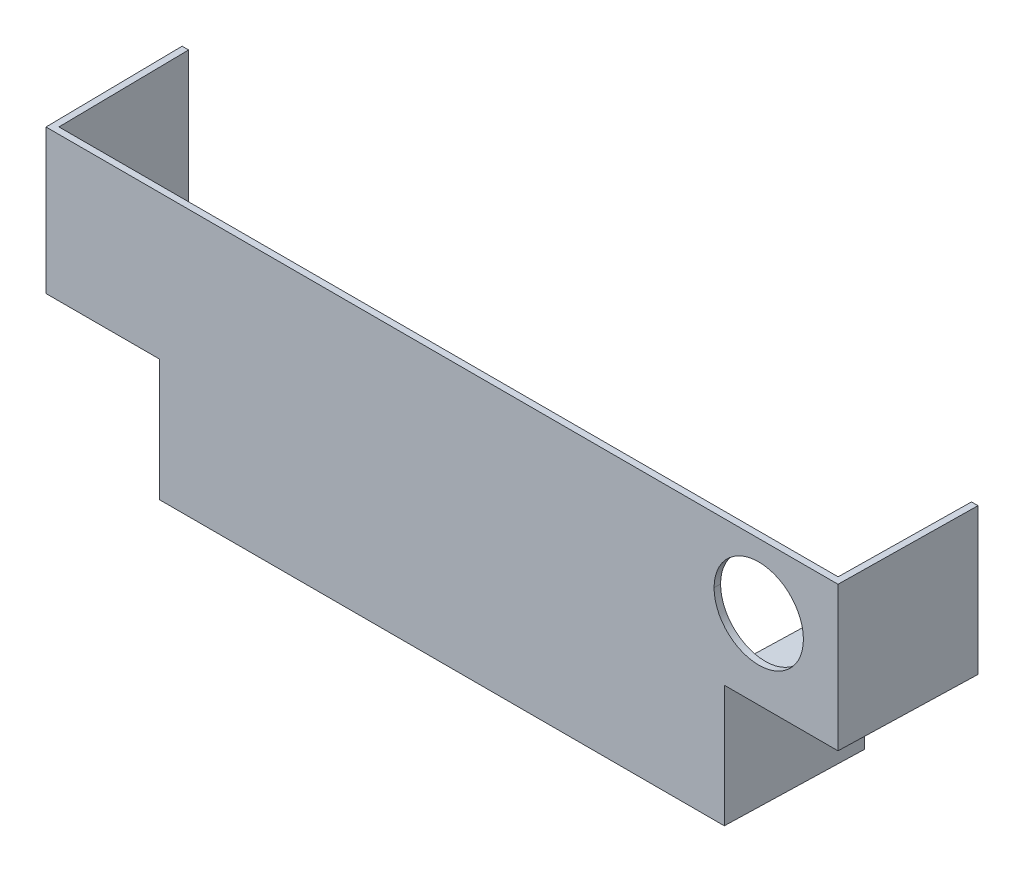
ISO-10303-21;
HEADER;
FILE_DESCRIPTION(('STEP AP214'),'2;1');
FILE_NAME('part.step','',(''),(''),'','','');
FILE_SCHEMA(('AUTOMOTIVE_DESIGN { 1 0 10303 214 1 1 1 1 }'));
ENDSEC;
DATA;
#1=APPLICATION_CONTEXT('core data for automotive mechanical design processes');
#2=APPLICATION_PROTOCOL_DEFINITION('international standard','automotive_design',2000,#1);
#3=PRODUCT_CONTEXT('',#1,'mechanical');
#4=PRODUCT('Part','Part','',(#3));
#5=PRODUCT_RELATED_PRODUCT_CATEGORY('part','',(#4));
#6=PRODUCT_DEFINITION_FORMATION('','',#4);
#7=PRODUCT_DEFINITION_CONTEXT('part definition',#1,'design');
#8=PRODUCT_DEFINITION('design','',#6,#7);
#9=PRODUCT_DEFINITION_SHAPE('','',#8);
#10=(LENGTH_UNIT() NAMED_UNIT(*) SI_UNIT(.MILLI.,.METRE.));
#11=(NAMED_UNIT(*) PLANE_ANGLE_UNIT() SI_UNIT($,.RADIAN.));
#12=(NAMED_UNIT(*) SI_UNIT($,.STERADIAN.) SOLID_ANGLE_UNIT());
#13=UNCERTAINTY_MEASURE_WITH_UNIT(LENGTH_MEASURE(1.E-05),#10,'distance_accuracy_value','');
#14=(GEOMETRIC_REPRESENTATION_CONTEXT(3) GLOBAL_UNCERTAINTY_ASSIGNED_CONTEXT((#13)) GLOBAL_UNIT_ASSIGNED_CONTEXT((#10,
#11,#12)) REPRESENTATION_CONTEXT('',''));
#15=CARTESIAN_POINT('',(0.,0.,0.));
#16=DIRECTION('',(0.,0.,1.));
#17=DIRECTION('',(1.,0.,0.));
#18=AXIS2_PLACEMENT_3D('',#15,#16,#17);
#19=CARTESIAN_POINT('',(90.437462,78.859218,-0.8500024));
#20=DIRECTION('',(0.,0.,1.));
#21=DIRECTION('',(1.,0.,0.));
#22=AXIS2_PLACEMENT_3D('',#19,#20,#21);
#23=CYLINDRICAL_SURFACE('',#22,2.75);
#24=DIRECTION('',(0.,0.,1.));
#25=VECTOR('',#24,1.);
#26=CARTESIAN_POINT('',(87.687462,78.859218,8.1));
#27=LINE('',#26,#25);
#28=CARTESIAN_POINT('',(87.687462,78.859218,8.1));
#29=VERTEX_POINT('',#28);
#30=CARTESIAN_POINT('',(87.687462,78.859218,8.5));
#31=VERTEX_POINT('',#30);
#32=EDGE_CURVE('E11',#29,#31,#27,.T.);
#33=ORIENTED_EDGE('',*,*,#32,.T.);
#34=CARTESIAN_POINT('',(90.437462,78.859218,8.5));
#35=DIRECTION('',(0.,0.,-1.));
#36=DIRECTION('',(1.,0.,0.));
#37=AXIS2_PLACEMENT_3D('',#34,#35,#36);
#38=CIRCLE('',#37,2.75);
#39=CARTESIAN_POINT('',(93.187462,78.859218,8.5));
#40=VERTEX_POINT('',#39);
#41=EDGE_CURVE('E304',#40,#31,#38,.T.);
#42=ORIENTED_EDGE('',*,*,#41,.F.);
#43=DIRECTION('',(0.,0.,1.));
#44=VECTOR('',#43,1.);
#45=CARTESIAN_POINT('',(93.187462,78.859218,8.1));
#46=LINE('',#45,#44);
#47=CARTESIAN_POINT('',(93.187462,78.859218,8.1));
#48=VERTEX_POINT('',#47);
#49=EDGE_CURVE('E28',#48,#40,#46,.T.);
#50=ORIENTED_EDGE('',*,*,#49,.F.);
#51=CARTESIAN_POINT('',(90.437462,78.859218,8.1));
#52=DIRECTION('',(0.,0.,1.));
#53=DIRECTION('',(-1.,0.,0.));
#54=AXIS2_PLACEMENT_3D('',#51,#52,#53);
#55=CIRCLE('',#54,2.75);
#56=EDGE_CURVE('E279',#29,#48,#55,.T.);
#57=ORIENTED_EDGE('',*,*,#56,.F.);
#58=EDGE_LOOP('',(#33,#42,#50,#57));
#59=FACE_BOUND('',#58,.T.);
#60=ADVANCED_FACE('F17',(#59),#23,.F.);
#61=CARTESIAN_POINT('',(90.437462,78.859218,-0.8500024));
#62=DIRECTION('',(0.,0.,1.));
#63=DIRECTION('',(1.,0.,0.));
#64=AXIS2_PLACEMENT_3D('',#61,#62,#63);
#65=CYLINDRICAL_SURFACE('',#64,2.75);
#66=ORIENTED_EDGE('',*,*,#49,.T.);
#67=CARTESIAN_POINT('',(90.437462,78.859218,8.5));
#68=DIRECTION('',(0.,0.,-1.));
#69=DIRECTION('',(-1.,0.,0.));
#70=AXIS2_PLACEMENT_3D('',#67,#68,#69);
#71=CIRCLE('',#70,2.75);
#72=EDGE_CURVE('E332',#31,#40,#71,.T.);
#73=ORIENTED_EDGE('',*,*,#72,.F.);
#74=ORIENTED_EDGE('',*,*,#32,.F.);
#75=CARTESIAN_POINT('',(90.437462,78.859218,8.1));
#76=DIRECTION('',(0.,0.,1.));
#77=DIRECTION('',(1.,0.,0.));
#78=AXIS2_PLACEMENT_3D('',#75,#76,#77);
#79=CIRCLE('',#78,2.75);
#80=EDGE_CURVE('E321',#48,#29,#79,.T.);
#81=ORIENTED_EDGE('',*,*,#80,.F.);
#82=EDGE_LOOP('',(#66,#73,#74,#81));
#83=FACE_BOUND('',#82,.T.);
#84=ADVANCED_FACE('F395',(#83),#65,.F.);
#85=CARTESIAN_POINT('',(0.,0.,8.1));
#86=DIRECTION('',(0.,0.,1.));
#87=DIRECTION('',(1.,0.,0.));
#88=AXIS2_PLACEMENT_3D('',#85,#86,#87);
#89=PLANE('',#88);
#90=ORIENTED_EDGE('',*,*,#56,.T.);
#91=ORIENTED_EDGE('',*,*,#80,.T.);
#92=EDGE_LOOP('',(#90,#91));
#93=FACE_BOUND('',#92,.T.);
#94=DIRECTION('',(-1.,0.,0.));
#95=VECTOR('',#94,1.);
#96=CARTESIAN_POINT('',(94.92435731426,74.37232268574,8.1));
#97=LINE('',#96,#95);
#98=CARTESIAN_POINT('',(94.92435731426,74.37232268574,8.1));
#99=VERTEX_POINT('',#98);
#100=CARTESIAN_POINT('',(87.92435731426,74.37232268574,8.1));
#101=VERTEX_POINT('',#100);
#102=EDGE_CURVE('E251',#99,#101,#97,.T.);
#103=ORIENTED_EDGE('',*,*,#102,.T.);
#104=DIRECTION('',(0.,-1.,0.));
#105=VECTOR('',#104,1.);
#106=CARTESIAN_POINT('',(87.92435731426,74.37232268574,8.1));
#107=LINE('',#106,#105);
#108=CARTESIAN_POINT('',(87.92435731426,66.87232268574,8.1));
#109=VERTEX_POINT('',#108);
#110=EDGE_CURVE('E244',#101,#109,#107,.T.);
#111=ORIENTED_EDGE('',*,*,#110,.T.);
#112=DIRECTION('',(-1.,0.,0.));
#113=VECTOR('',#112,1.);
#114=CARTESIAN_POINT('',(87.92435731426,66.87232268574,8.1));
#115=LINE('',#114,#113);
#116=CARTESIAN_POINT('',(53.95056668574,66.87232268574,8.1));
#117=VERTEX_POINT('',#116);
#118=EDGE_CURVE('E245',#109,#117,#115,.T.);
#119=ORIENTED_EDGE('',*,*,#118,.T.);
#120=DIRECTION('',(0.,1.,0.));
#121=VECTOR('',#120,1.);
#122=CARTESIAN_POINT('',(53.95056668574,66.87232268574,8.1));
#123=LINE('',#122,#121);
#124=CARTESIAN_POINT('',(53.95056668574,74.37232268574,8.1));
#125=VERTEX_POINT('',#124);
#126=EDGE_CURVE('E219',#117,#125,#123,.T.);
#127=ORIENTED_EDGE('',*,*,#126,.T.);
#128=DIRECTION('',(-1.,0.,0.));
#129=VECTOR('',#128,1.);
#130=CARTESIAN_POINT('',(53.95056668574,74.37232268574,8.1));
#131=LINE('',#130,#129);
#132=CARTESIAN_POINT('',(46.95056668574,74.37232268574,8.1));
#133=VERTEX_POINT('',#132);
#134=EDGE_CURVE('E220',#125,#133,#131,.T.);
#135=ORIENTED_EDGE('',*,*,#134,.T.);
#136=DIRECTION('',(0.,1.,0.));
#137=VECTOR('',#136,1.);
#138=CARTESIAN_POINT('',(46.95056668574,74.37232268574,8.1));
#139=LINE('',#138,#137);
#140=CARTESIAN_POINT('',(46.95056668574,82.859218,8.1));
#141=VERTEX_POINT('',#140);
#142=EDGE_CURVE('E227',#133,#141,#139,.T.);
#143=ORIENTED_EDGE('',*,*,#142,.T.);
#144=DIRECTION('',(1.,0.,0.));
#145=VECTOR('',#144,1.);
#146=CARTESIAN_POINT('',(46.95056668574,82.859218,8.1));
#147=LINE('',#146,#145);
#148=CARTESIAN_POINT('',(94.92435731426,82.859218,8.1));
#149=VERTEX_POINT('',#148);
#150=EDGE_CURVE('E317',#141,#149,#147,.T.);
#151=ORIENTED_EDGE('',*,*,#150,.T.);
#152=DIRECTION('',(0.,-1.,0.));
#153=VECTOR('',#152,1.);
#154=CARTESIAN_POINT('',(94.92435731426,82.859218,8.1));
#155=LINE('',#154,#153);
#156=EDGE_CURVE('E250',#149,#99,#155,.T.);
#157=ORIENTED_EDGE('',*,*,#156,.T.);
#158=EDGE_LOOP('',(#103,#111,#119,#127,#135,#143,#151,#157));
#159=FACE_BOUND('',#158,.T.);
#160=ADVANCED_FACE('F399',(#93,#159),#89,.F.);
#161=CARTESIAN_POINT('',(95.037462,82.859218,0.));
#162=DIRECTION('',(0.999902524009304,0.,0.0139621803391542));
#163=DIRECTION('',(0.,-1.,0.));
#164=AXIS2_PLACEMENT_3D('',#161,#162,#163);
#165=PLANE('',#164);
#166=ORIENTED_EDGE('',*,*,#156,.F.);
#167=DIRECTION('',(-0.0139621803392142,0.,0.999902524009303));
#168=VECTOR('',#167,1.);
#169=CARTESIAN_POINT('',(95.037462,82.859218,0.));
#170=LINE('',#169,#168);
#171=CARTESIAN_POINT('',(95.037462,82.859218,0.));
#172=VERTEX_POINT('',#171);
#173=EDGE_CURVE('E293',#172,#149,#170,.T.);
#174=ORIENTED_EDGE('',*,*,#173,.F.);
#175=DIRECTION('',(0.,-1.,0.));
#176=VECTOR('',#175,1.);
#177=CARTESIAN_POINT('',(95.037462,82.859218,0.));
#178=LINE('',#177,#176);
#179=CARTESIAN_POINT('',(95.037462,74.259218,0.));
#180=VERTEX_POINT('',#179);
#181=EDGE_CURVE('E262',#172,#180,#178,.T.);
#182=ORIENTED_EDGE('',*,*,#181,.T.);
#183=DIRECTION('',(-0.0139608196271266,0.0139608196271266,0.999805076517757));
#184=VECTOR('',#183,1.);
#185=CARTESIAN_POINT('',(95.037462,74.259218,0.));
#186=LINE('',#185,#184);
#187=EDGE_CURVE('E246',#180,#99,#186,.T.);
#188=ORIENTED_EDGE('',*,*,#187,.T.);
#189=EDGE_LOOP('',(#166,#174,#182,#188));
#190=FACE_BOUND('',#189,.T.);
#191=ADVANCED_FACE('F412',(#190),#165,.F.);
#192=CARTESIAN_POINT('',(53.837462,74.259218,0.));
#193=DIRECTION('',(0.,-0.999902524009304,0.0139621803391542));
#194=DIRECTION('',(-1.,0.,0.));
#195=AXIS2_PLACEMENT_3D('',#192,#193,#194);
#196=PLANE('',#195);
#197=ORIENTED_EDGE('',*,*,#102,.F.);
#198=ORIENTED_EDGE('',*,*,#187,.F.);
#199=DIRECTION('',(-1.,0.,0.));
#200=VECTOR('',#199,1.);
#201=CARTESIAN_POINT('',(95.037462,74.259218,0.));
#202=LINE('',#201,#200);
#203=CARTESIAN_POINT('',(88.037462,74.259218,0.));
#204=VERTEX_POINT('',#203);
#205=EDGE_CURVE('E258',#180,#204,#202,.T.);
#206=ORIENTED_EDGE('',*,*,#205,.T.);
#207=DIRECTION('',(0.0139608196271266,-0.0139608196271266,-0.999805076517757));
#208=VECTOR('',#207,1.);
#209=CARTESIAN_POINT('',(87.92435731426,74.37232268574,8.1));
#210=LINE('',#209,#208);
#211=EDGE_CURVE('E264',#101,#204,#210,.T.);
#212=ORIENTED_EDGE('',*,*,#211,.F.);
#213=EDGE_LOOP('',(#197,#198,#206,#212));
#214=FACE_BOUND('',#213,.T.);
#215=ADVANCED_FACE('F417',(#214),#196,.F.);
#216=CARTESIAN_POINT('',(88.037462,74.259218,0.));
#217=DIRECTION('',(0.999902524009304,0.,0.0139621803391542));
#218=DIRECTION('',(0.,-1.,0.));
#219=AXIS2_PLACEMENT_3D('',#216,#217,#218);
#220=PLANE('',#219);
#221=ORIENTED_EDGE('',*,*,#110,.F.);
#222=ORIENTED_EDGE('',*,*,#211,.T.);
#223=DIRECTION('',(0.,-1.,0.));
#224=VECTOR('',#223,1.);
#225=CARTESIAN_POINT('',(88.037462,74.259218,0.));
#226=LINE('',#225,#224);
#227=CARTESIAN_POINT('',(88.037462,66.759218,0.));
#228=VERTEX_POINT('',#227);
#229=EDGE_CURVE('E263',#204,#228,#226,.T.);
#230=ORIENTED_EDGE('',*,*,#229,.T.);
#231=DIRECTION('',(-0.0139608196271266,0.0139608196271266,0.999805076517757));
#232=VECTOR('',#231,1.);
#233=CARTESIAN_POINT('',(88.037462,66.759218,0.));
#234=LINE('',#233,#232);
#235=EDGE_CURVE('E240',#228,#109,#234,.T.);
#236=ORIENTED_EDGE('',*,*,#235,.T.);
#237=EDGE_LOOP('',(#221,#222,#230,#236));
#238=FACE_BOUND('',#237,.T.);
#239=ADVANCED_FACE('F424',(#238),#220,.F.);
#240=CARTESIAN_POINT('',(88.037462,66.759218,0.));
#241=DIRECTION('',(0.,-0.999902524009304,0.0139621803391542));
#242=DIRECTION('',(-1.,0.,0.));
#243=AXIS2_PLACEMENT_3D('',#240,#241,#242);
#244=PLANE('',#243);
#245=ORIENTED_EDGE('',*,*,#118,.F.);
#246=ORIENTED_EDGE('',*,*,#235,.F.);
#247=DIRECTION('',(-1.,0.,0.));
#248=VECTOR('',#247,1.);
#249=CARTESIAN_POINT('',(88.037462,66.759218,0.));
#250=LINE('',#249,#248);
#251=CARTESIAN_POINT('',(53.837462,66.759218,0.));
#252=VERTEX_POINT('',#251);
#253=EDGE_CURVE('E273',#228,#252,#250,.T.);
#254=ORIENTED_EDGE('',*,*,#253,.T.);
#255=DIRECTION('',(0.0139608196271266,0.0139608196271266,0.999805076517757));
#256=VECTOR('',#255,1.);
#257=CARTESIAN_POINT('',(53.837462,66.759218,0.));
#258=LINE('',#257,#256);
#259=EDGE_CURVE('E353',#252,#117,#258,.T.);
#260=ORIENTED_EDGE('',*,*,#259,.T.);
#261=EDGE_LOOP('',(#245,#246,#254,#260));
#262=FACE_BOUND('',#261,.T.);
#263=ADVANCED_FACE('F431',(#262),#244,.F.);
#264=CARTESIAN_POINT('',(53.837462,66.759218,0.));
#265=DIRECTION('',(-0.999902524009304,0.,0.0139621803391542));
#266=DIRECTION('',(0.,1.,0.));
#267=AXIS2_PLACEMENT_3D('',#264,#265,#266);
#268=PLANE('',#267);
#269=ORIENTED_EDGE('',*,*,#126,.F.);
#270=ORIENTED_EDGE('',*,*,#259,.F.);
#271=DIRECTION('',(0.,1.,0.));
#272=VECTOR('',#271,1.);
#273=CARTESIAN_POINT('',(53.837462,66.759218,0.));
#274=LINE('',#273,#272);
#275=CARTESIAN_POINT('',(53.837462,74.259218,0.));
#276=VERTEX_POINT('',#275);
#277=EDGE_CURVE('E256',#252,#276,#274,.T.);
#278=ORIENTED_EDGE('',*,*,#277,.T.);
#279=DIRECTION('',(-0.0139608196271266,-0.0139608196271266,-0.999805076517757));
#280=VECTOR('',#279,1.);
#281=CARTESIAN_POINT('',(53.95056668574,74.37232268574,8.1));
#282=LINE('',#281,#280);
#283=EDGE_CURVE('E216',#125,#276,#282,.T.);
#284=ORIENTED_EDGE('',*,*,#283,.F.);
#285=EDGE_LOOP('',(#269,#270,#278,#284));
#286=FACE_BOUND('',#285,.T.);
#287=ADVANCED_FACE('F429',(#286),#268,.F.);
#288=CARTESIAN_POINT('',(53.837462,74.259218,0.));
#289=DIRECTION('',(0.,-0.999902524009304,0.0139621803391542));
#290=DIRECTION('',(-1.,0.,0.));
#291=AXIS2_PLACEMENT_3D('',#288,#289,#290);
#292=PLANE('',#291);
#293=ORIENTED_EDGE('',*,*,#134,.F.);
#294=ORIENTED_EDGE('',*,*,#283,.T.);
#295=DIRECTION('',(-1.,0.,0.));
#296=VECTOR('',#295,1.);
#297=CARTESIAN_POINT('',(53.837462,74.259218,0.));
#298=LINE('',#297,#296);
#299=CARTESIAN_POINT('',(46.837462,74.259218,0.));
#300=VERTEX_POINT('',#299);
#301=EDGE_CURVE('E252',#276,#300,#298,.T.);
#302=ORIENTED_EDGE('',*,*,#301,.T.);
#303=DIRECTION('',(0.0139608196271266,0.0139608196271266,0.999805076517757));
#304=VECTOR('',#303,1.);
#305=CARTESIAN_POINT('',(46.837462,74.259218,0.));
#306=LINE('',#305,#304);
#307=EDGE_CURVE('E230',#300,#133,#306,.T.);
#308=ORIENTED_EDGE('',*,*,#307,.T.);
#309=EDGE_LOOP('',(#293,#294,#302,#308));
#310=FACE_BOUND('',#309,.T.);
#311=ADVANCED_FACE('F19',(#310),#292,.F.);
#312=CARTESIAN_POINT('',(46.837462,74.259218,0.));
#313=DIRECTION('',(-0.999902524009304,0.,0.0139621803391542));
#314=DIRECTION('',(0.,1.,0.));
#315=AXIS2_PLACEMENT_3D('',#312,#313,#314);
#316=PLANE('',#315);
#317=ORIENTED_EDGE('',*,*,#142,.F.);
#318=ORIENTED_EDGE('',*,*,#307,.F.);
#319=DIRECTION('',(0.,1.,0.));
#320=VECTOR('',#319,1.);
#321=CARTESIAN_POINT('',(46.837462,74.259218,0.));
#322=LINE('',#321,#320);
#323=CARTESIAN_POINT('',(46.837462,82.859218,0.));
#324=VERTEX_POINT('',#323);
#325=EDGE_CURVE('E257',#300,#324,#322,.T.);
#326=ORIENTED_EDGE('',*,*,#325,.T.);
#327=DIRECTION('',(-0.0139621803392142,0.,-0.999902524009303));
#328=VECTOR('',#327,1.);
#329=CARTESIAN_POINT('',(46.95056668574,82.859218,8.1));
#330=LINE('',#329,#328);
#331=EDGE_CURVE('E231',#141,#324,#330,.T.);
#332=ORIENTED_EDGE('',*,*,#331,.F.);
#333=EDGE_LOOP('',(#317,#318,#326,#332));
#334=FACE_BOUND('',#333,.T.);
#335=ADVANCED_FACE('F452',(#334),#316,.F.);
#336=CARTESIAN_POINT('',(46.437462,82.859218,0.));
#337=DIRECTION('',(0.,1.,0.));
#338=DIRECTION('',(1.,0.,0.));
#339=AXIS2_PLACEMENT_3D('',#336,#337,#338);
#340=PLANE('',#339);
#341=DIRECTION('',(0.0139621803392342,0.,0.999902524009303));
#342=VECTOR('',#341,1.);
#343=CARTESIAN_POINT('',(46.437462,82.859218,0.));
#344=LINE('',#343,#342);
#345=CARTESIAN_POINT('',(46.437462,82.859218,0.));
#346=VERTEX_POINT('',#345);
#347=CARTESIAN_POINT('',(46.55615210232,82.859218,8.5));
#348=VERTEX_POINT('',#347);
#349=EDGE_CURVE('E238',#346,#348,#344,.T.);
#350=ORIENTED_EDGE('',*,*,#349,.T.);
#351=DIRECTION('',(1.,0.,0.));
#352=VECTOR('',#351,1.);
#353=CARTESIAN_POINT('',(46.55615210232,82.859218,8.5));
#354=LINE('',#353,#352);
#355=CARTESIAN_POINT('',(95.31877189768,82.859218,8.5));
#356=VERTEX_POINT('',#355);
#357=EDGE_CURVE('E310',#348,#356,#354,.T.);
#358=ORIENTED_EDGE('',*,*,#357,.T.);
#359=DIRECTION('',(0.0139621803392342,0.,-0.999902524009303));
#360=VECTOR('',#359,1.);
#361=CARTESIAN_POINT('',(95.31877189768,82.859218,8.5));
#362=LINE('',#361,#360);
#363=CARTESIAN_POINT('',(95.437462,82.859218,0.));
#364=VERTEX_POINT('',#363);
#365=EDGE_CURVE('E299',#356,#364,#362,.T.);
#366=ORIENTED_EDGE('',*,*,#365,.T.);
#367=DIRECTION('',(1.,0.,0.));
#368=VECTOR('',#367,1.);
#369=CARTESIAN_POINT('',(95.037462,82.859218,0.));
#370=LINE('',#369,#368);
#371=EDGE_CURVE('E234',#172,#364,#370,.T.);
#372=ORIENTED_EDGE('',*,*,#371,.F.);
#373=ORIENTED_EDGE('',*,*,#173,.T.);
#374=ORIENTED_EDGE('',*,*,#150,.F.);
#375=ORIENTED_EDGE('',*,*,#331,.T.);
#376=DIRECTION('',(1.,0.,0.));
#377=VECTOR('',#376,1.);
#378=CARTESIAN_POINT('',(46.437462,82.859218,0.));
#379=LINE('',#378,#377);
#380=EDGE_CURVE('E225',#346,#324,#379,.T.);
#381=ORIENTED_EDGE('',*,*,#380,.F.);
#382=EDGE_LOOP('',(#350,#358,#366,#372,#373,#374,#375,#381));
#383=FACE_BOUND('',#382,.T.);
#384=ADVANCED_FACE('F368',(#383),#340,.T.);
#385=CARTESIAN_POINT('',(46.437462,66.359218,0.));
#386=DIRECTION('',(-0.999902524009304,0.,0.0139621803391542));
#387=DIRECTION('',(0.,1.,0.));
#388=AXIS2_PLACEMENT_3D('',#385,#386,#387);
#389=PLANE('',#388);
#390=DIRECTION('',(0.,1.,0.));
#391=VECTOR('',#390,1.);
#392=CARTESIAN_POINT('',(46.55615210232,73.97790810232,8.5));
#393=LINE('',#392,#391);
#394=CARTESIAN_POINT('',(46.55615210232,73.97790810232,8.5));
#395=VERTEX_POINT('',#394);
#396=EDGE_CURVE('E288',#395,#348,#393,.T.);
#397=ORIENTED_EDGE('',*,*,#396,.T.);
#398=ORIENTED_EDGE('',*,*,#349,.F.);
#399=DIRECTION('',(0.,1.,0.));
#400=VECTOR('',#399,1.);
#401=CARTESIAN_POINT('',(46.437462,73.859218,0.));
#402=LINE('',#401,#400);
#403=CARTESIAN_POINT('',(46.437462,73.859218,0.));
#404=VERTEX_POINT('',#403);
#405=EDGE_CURVE('E221',#404,#346,#402,.T.);
#406=ORIENTED_EDGE('',*,*,#405,.F.);
#407=DIRECTION('',(0.0139608196271366,0.0139608196271366,0.999805076517757));
#408=VECTOR('',#407,1.);
#409=CARTESIAN_POINT('',(46.437462,73.859218,0.));
#410=LINE('',#409,#408);
#411=EDGE_CURVE('E235',#404,#395,#410,.T.);
#412=ORIENTED_EDGE('',*,*,#411,.T.);
#413=EDGE_LOOP('',(#397,#398,#406,#412));
#414=FACE_BOUND('',#413,.T.);
#415=ADVANCED_FACE('F461',(#414),#389,.T.);
#416=CARTESIAN_POINT('',(88.437462,73.859218,0.));
#417=DIRECTION('',(0.,0.999902524009304,-0.0139621803391542));
#418=DIRECTION('',(-1.,0.,0.));
#419=AXIS2_PLACEMENT_3D('',#416,#417,#418);
#420=PLANE('',#419);
#421=DIRECTION('',(1.,0.,0.));
#422=VECTOR('',#421,1.);
#423=CARTESIAN_POINT('',(46.55615210232,73.97790810232,8.5));
#424=LINE('',#423,#422);
#425=CARTESIAN_POINT('',(53.55615210232,73.97790810232,8.5));
#426=VERTEX_POINT('',#425);
#427=EDGE_CURVE('E283',#395,#426,#424,.T.);
#428=ORIENTED_EDGE('',*,*,#427,.F.);
#429=ORIENTED_EDGE('',*,*,#411,.F.);
#430=DIRECTION('',(1.,0.,0.));
#431=VECTOR('',#430,1.);
#432=CARTESIAN_POINT('',(46.437462,73.859218,0.));
#433=LINE('',#432,#431);
#434=CARTESIAN_POINT('',(53.437462,73.859218,0.));
#435=VERTEX_POINT('',#434);
#436=EDGE_CURVE('E226',#404,#435,#433,.T.);
#437=ORIENTED_EDGE('',*,*,#436,.T.);
#438=DIRECTION('',(0.0139608196271366,0.0139608196271366,0.999805076517757));
#439=VECTOR('',#438,1.);
#440=CARTESIAN_POINT('',(53.437462,73.859218,0.));
#441=LINE('',#440,#439);
#442=EDGE_CURVE('E239',#435,#426,#441,.T.);
#443=ORIENTED_EDGE('',*,*,#442,.T.);
#444=EDGE_LOOP('',(#428,#429,#437,#443));
#445=FACE_BOUND('',#444,.T.);
#446=ADVANCED_FACE('F458',(#445),#420,.F.);
#447=CARTESIAN_POINT('',(53.437462,73.859218,0.));
#448=DIRECTION('',(0.999902524009304,0.,-0.0139621803391542));
#449=DIRECTION('',(0.,-1.,0.));
#450=AXIS2_PLACEMENT_3D('',#447,#448,#449);
#451=PLANE('',#450);
#452=DIRECTION('',(0.,-1.,0.));
#453=VECTOR('',#452,1.);
#454=CARTESIAN_POINT('',(53.55615210232,73.97790810232,8.5));
#455=LINE('',#454,#453);
#456=CARTESIAN_POINT('',(53.55615210232,66.47790810232,8.5));
#457=VERTEX_POINT('',#456);
#458=EDGE_CURVE('E287',#426,#457,#455,.T.);
#459=ORIENTED_EDGE('',*,*,#458,.F.);
#460=ORIENTED_EDGE('',*,*,#442,.F.);
#461=DIRECTION('',(0.,-1.,0.));
#462=VECTOR('',#461,1.);
#463=CARTESIAN_POINT('',(53.437462,73.859218,0.));
#464=LINE('',#463,#462);
#465=CARTESIAN_POINT('',(53.437462,66.359218,0.));
#466=VERTEX_POINT('',#465);
#467=EDGE_CURVE('E213',#435,#466,#464,.T.);
#468=ORIENTED_EDGE('',*,*,#467,.T.);
#469=DIRECTION('',(-0.0139608196271366,-0.0139608196271366,-0.999805076517757));
#470=VECTOR('',#469,1.);
#471=CARTESIAN_POINT('',(53.55615210232,66.47790810232,8.5));
#472=LINE('',#471,#470);
#473=EDGE_CURVE('E269',#457,#466,#472,.T.);
#474=ORIENTED_EDGE('',*,*,#473,.F.);
#475=EDGE_LOOP('',(#459,#460,#468,#474));
#476=FACE_BOUND('',#475,.T.);
#477=ADVANCED_FACE('F447',(#476),#451,.F.);
#478=CARTESIAN_POINT('',(95.437462,66.359218,0.));
#479=DIRECTION('',(0.,-0.999902524009304,0.0139621803391542));
#480=DIRECTION('',(-1.,0.,0.));
#481=AXIS2_PLACEMENT_3D('',#478,#479,#480);
#482=PLANE('',#481);
#483=DIRECTION('',(-1.,0.,0.));
#484=VECTOR('',#483,1.);
#485=CARTESIAN_POINT('',(88.437462,66.359218,0.));
#486=LINE('',#485,#484);
#487=CARTESIAN_POINT('',(88.437462,66.359218,0.));
#488=VERTEX_POINT('',#487);
#489=EDGE_CURVE('E207',#488,#466,#486,.T.);
#490=ORIENTED_EDGE('',*,*,#489,.F.);
#491=DIRECTION('',(-0.0139608196271266,0.0139608196271366,0.999805076517757));
#492=VECTOR('',#491,1.);
#493=CARTESIAN_POINT('',(88.437462,66.359218,0.));
#494=LINE('',#493,#492);
#495=CARTESIAN_POINT('',(88.31877189768,66.47790810232,8.5));
#496=VERTEX_POINT('',#495);
#497=EDGE_CURVE('E204',#488,#496,#494,.T.);
#498=ORIENTED_EDGE('',*,*,#497,.T.);
#499=DIRECTION('',(-1.,0.,0.));
#500=VECTOR('',#499,1.);
#501=CARTESIAN_POINT('',(88.31877189768,66.47790810232,8.5));
#502=LINE('',#501,#500);
#503=EDGE_CURVE('E329',#496,#457,#502,.T.);
#504=ORIENTED_EDGE('',*,*,#503,.T.);
#505=ORIENTED_EDGE('',*,*,#473,.T.);
#506=EDGE_LOOP('',(#490,#498,#504,#505));
#507=FACE_BOUND('',#506,.T.);
#508=ADVANCED_FACE('F441',(#507),#482,.T.);
#509=CARTESIAN_POINT('',(88.437462,59.17166050852,0.));
#510=DIRECTION('',(-0.999902524009304,0.,-0.0139621803391542));
#511=DIRECTION('',(-0.0139621803391542,0.,0.999902524009304));
#512=AXIS2_PLACEMENT_3D('',#509,#510,#511);
#513=PLANE('',#512);
#514=DIRECTION('',(0.,1.,0.));
#515=VECTOR('',#514,1.);
#516=CARTESIAN_POINT('',(88.31877189768,66.47790810232,8.5));
#517=LINE('',#516,#515);
#518=CARTESIAN_POINT('',(88.31877189768,73.97790810232,8.5));
#519=VERTEX_POINT('',#518);
#520=EDGE_CURVE('E330',#496,#519,#517,.T.);
#521=ORIENTED_EDGE('',*,*,#520,.F.);
#522=ORIENTED_EDGE('',*,*,#497,.F.);
#523=DIRECTION('',(0.,1.,0.));
#524=VECTOR('',#523,1.);
#525=CARTESIAN_POINT('',(88.437462,66.359218,0.));
#526=LINE('',#525,#524);
#527=CARTESIAN_POINT('',(88.437462,73.859218,0.));
#528=VERTEX_POINT('',#527);
#529=EDGE_CURVE('E197',#488,#528,#526,.T.);
#530=ORIENTED_EDGE('',*,*,#529,.T.);
#531=DIRECTION('',(-0.0139608196271266,0.0139608196271366,0.999805076517757));
#532=VECTOR('',#531,1.);
#533=CARTESIAN_POINT('',(88.437462,73.859218,0.));
#534=LINE('',#533,#532);
#535=EDGE_CURVE('E180',#528,#519,#534,.T.);
#536=ORIENTED_EDGE('',*,*,#535,.T.);
#537=EDGE_LOOP('',(#521,#522,#530,#536));
#538=FACE_BOUND('',#537,.T.);
#539=ADVANCED_FACE('F203',(#538),#513,.F.);
#540=CARTESIAN_POINT('',(0.,0.,8.5));
#541=DIRECTION('',(0.,0.,1.));
#542=DIRECTION('',(1.,0.,0.));
#543=AXIS2_PLACEMENT_3D('',#540,#541,#542);
#544=PLANE('',#543);
#545=ORIENTED_EDGE('',*,*,#72,.T.);
#546=ORIENTED_EDGE('',*,*,#41,.T.);
#547=EDGE_LOOP('',(#545,#546));
#548=FACE_BOUND('',#547,.T.);
#549=ORIENTED_EDGE('',*,*,#357,.F.);
#550=ORIENTED_EDGE('',*,*,#396,.F.);
#551=ORIENTED_EDGE('',*,*,#427,.T.);
#552=ORIENTED_EDGE('',*,*,#458,.T.);
#553=ORIENTED_EDGE('',*,*,#503,.F.);
#554=ORIENTED_EDGE('',*,*,#520,.T.);
#555=DIRECTION('',(1.,0.,0.));
#556=VECTOR('',#555,1.);
#557=CARTESIAN_POINT('',(88.31877189768,73.97790810232,8.5));
#558=LINE('',#557,#556);
#559=CARTESIAN_POINT('',(95.31877189768,73.97790810232,8.5));
#560=VERTEX_POINT('',#559);
#561=EDGE_CURVE('E21',#519,#560,#558,.T.);
#562=ORIENTED_EDGE('',*,*,#561,.T.);
#563=DIRECTION('',(0.,-1.,0.));
#564=VECTOR('',#563,1.);
#565=CARTESIAN_POINT('',(95.31877189768,82.859218,8.5));
#566=LINE('',#565,#564);
#567=EDGE_CURVE('E357',#356,#560,#566,.T.);
#568=ORIENTED_EDGE('',*,*,#567,.F.);
#569=EDGE_LOOP('',(#549,#550,#551,#552,#553,#554,#562,#568));
#570=FACE_BOUND('',#569,.T.);
#571=ADVANCED_FACE('F373',(#548,#570),#544,.T.);
#572=CARTESIAN_POINT('',(95.437462,82.859218,0.));
#573=DIRECTION('',(0.999902524009304,0.,0.0139621803391542));
#574=DIRECTION('',(0.,-1.,0.));
#575=AXIS2_PLACEMENT_3D('',#572,#573,#574);
#576=PLANE('',#575);
#577=ORIENTED_EDGE('',*,*,#365,.F.);
#578=ORIENTED_EDGE('',*,*,#567,.T.);
#579=DIRECTION('',(0.0139608196271366,-0.0139608196271366,-0.999805076517757));
#580=VECTOR('',#579,1.);
#581=CARTESIAN_POINT('',(95.31877189768,73.97790810232,8.5));
#582=LINE('',#581,#580);
#583=CARTESIAN_POINT('',(95.437462,73.859218,0.));
#584=VERTEX_POINT('',#583);
#585=EDGE_CURVE('E191',#560,#584,#582,.T.);
#586=ORIENTED_EDGE('',*,*,#585,.T.);
#587=DIRECTION('',(0.,-1.,0.));
#588=VECTOR('',#587,1.);
#589=CARTESIAN_POINT('',(95.437462,82.859218,0.));
#590=LINE('',#589,#588);
#591=EDGE_CURVE('E200',#364,#584,#590,.T.);
#592=ORIENTED_EDGE('',*,*,#591,.F.);
#593=EDGE_LOOP('',(#577,#578,#586,#592));
#594=FACE_BOUND('',#593,.T.);
#595=ADVANCED_FACE('F375',(#594),#576,.T.);
#596=CARTESIAN_POINT('',(88.437462,73.859218,0.));
#597=DIRECTION('',(0.,0.999902524009304,-0.0139621803391542));
#598=DIRECTION('',(-1.,0.,0.));
#599=AXIS2_PLACEMENT_3D('',#596,#597,#598);
#600=PLANE('',#599);
#601=ORIENTED_EDGE('',*,*,#561,.F.);
#602=ORIENTED_EDGE('',*,*,#535,.F.);
#603=DIRECTION('',(1.,0.,0.));
#604=VECTOR('',#603,1.);
#605=CARTESIAN_POINT('',(88.437462,73.859218,0.));
#606=LINE('',#605,#604);
#607=EDGE_CURVE('E184',#528,#584,#606,.T.);
#608=ORIENTED_EDGE('',*,*,#607,.T.);
#609=ORIENTED_EDGE('',*,*,#585,.F.);
#610=EDGE_LOOP('',(#601,#602,#608,#609));
#611=FACE_BOUND('',#610,.T.);
#612=ADVANCED_FACE('F182',(#611),#600,.F.);
#613=CARTESIAN_POINT('',(0.,0.,0.));
#614=DIRECTION('',(0.,0.,1.));
#615=DIRECTION('',(1.,0.,0.));
#616=AXIS2_PLACEMENT_3D('',#613,#614,#615);
#617=PLANE('',#616);
#618=ORIENTED_EDGE('',*,*,#529,.F.);
#619=ORIENTED_EDGE('',*,*,#489,.T.);
#620=ORIENTED_EDGE('',*,*,#467,.F.);
#621=ORIENTED_EDGE('',*,*,#436,.F.);
#622=ORIENTED_EDGE('',*,*,#405,.T.);
#623=ORIENTED_EDGE('',*,*,#380,.T.);
#624=ORIENTED_EDGE('',*,*,#325,.F.);
#625=ORIENTED_EDGE('',*,*,#301,.F.);
#626=ORIENTED_EDGE('',*,*,#277,.F.);
#627=ORIENTED_EDGE('',*,*,#253,.F.);
#628=ORIENTED_EDGE('',*,*,#229,.F.);
#629=ORIENTED_EDGE('',*,*,#205,.F.);
#630=ORIENTED_EDGE('',*,*,#181,.F.);
#631=ORIENTED_EDGE('',*,*,#371,.T.);
#632=ORIENTED_EDGE('',*,*,#591,.T.);
#633=ORIENTED_EDGE('',*,*,#607,.F.);
#634=EDGE_LOOP('',(#618,#619,#620,#621,#622,#623,#624,#625,#626,#627,#628,#629,#630,#631,#632,#633));
#635=FACE_BOUND('',#634,.T.);
#636=ADVANCED_FACE('F195',(#635),#617,.F.);
#637=CLOSED_SHELL('',(#60,#84,#160,#191,#215,#239,#263,#287,#311,#335,#384,#415,#446,#477,#508,
#539,#571,#595,#612,#636));
#638=MANIFOLD_SOLID_BREP('B1',#637);
#639=ADVANCED_BREP_SHAPE_REPRESENTATION('',(#18,#638),#14);
#640=SHAPE_DEFINITION_REPRESENTATION(#9,#639);
ENDSEC;
END-ISO-10303-21;
